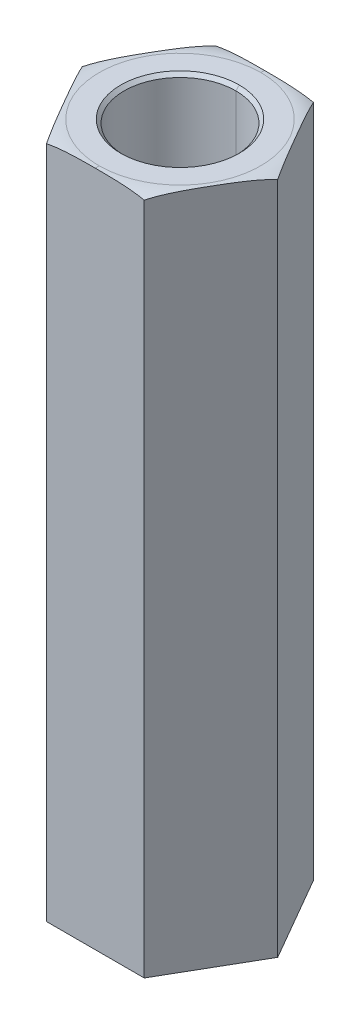
ISO-10303-21;
HEADER;
FILE_DESCRIPTION(('STEP AP214'),'2;1');
FILE_NAME('part.step','',(''),(''),'','','');
FILE_SCHEMA(('AUTOMOTIVE_DESIGN { 1 0 10303 214 1 1 1 1 }'));
ENDSEC;
DATA;
#1=APPLICATION_CONTEXT('core data for automotive mechanical design processes');
#2=APPLICATION_PROTOCOL_DEFINITION('international standard','automotive_design',2000,#1);
#3=PRODUCT_CONTEXT('',#1,'mechanical');
#4=PRODUCT('Part','Part','',(#3));
#5=PRODUCT_RELATED_PRODUCT_CATEGORY('part','',(#4));
#6=PRODUCT_DEFINITION_FORMATION('','',#4);
#7=PRODUCT_DEFINITION_CONTEXT('part definition',#1,'design');
#8=PRODUCT_DEFINITION('design','',#6,#7);
#9=PRODUCT_DEFINITION_SHAPE('','',#8);
#10=(LENGTH_UNIT() NAMED_UNIT(*) SI_UNIT(.MILLI.,.METRE.));
#11=(NAMED_UNIT(*) PLANE_ANGLE_UNIT() SI_UNIT($,.RADIAN.));
#12=(NAMED_UNIT(*) SI_UNIT($,.STERADIAN.) SOLID_ANGLE_UNIT());
#13=UNCERTAINTY_MEASURE_WITH_UNIT(LENGTH_MEASURE(1.E-05),#10,'distance_accuracy_value','');
#14=(GEOMETRIC_REPRESENTATION_CONTEXT(3) GLOBAL_UNCERTAINTY_ASSIGNED_CONTEXT((#13)) GLOBAL_UNIT_ASSIGNED_CONTEXT((#10,
#11,#12)) REPRESENTATION_CONTEXT('',''));
#15=CARTESIAN_POINT('',(0.,0.,0.));
#16=DIRECTION('',(0.,0.,1.));
#17=DIRECTION('',(1.,0.,0.));
#18=AXIS2_PLACEMENT_3D('',#15,#16,#17);
#19=CARTESIAN_POINT('',(-3.66617420935412,76.2,0.));
#20=DIRECTION('',(0.866025403784439,0.,0.5));
#21=DIRECTION('',(0.,-1.,0.));
#22=AXIS2_PLACEMENT_3D('',#19,#20,#21);
#23=PLANE('',#22);
#24=DIRECTION('',(-0.5,0.,0.866025403784439));
#25=VECTOR('',#24,1.);
#26=CARTESIAN_POINT('',(-3.66617420935412,50.8,0.));
#27=LINE('',#26,#25);
#28=CARTESIAN_POINT('',(-1.83308710467708,50.8,-3.175));
#29=VERTEX_POINT('',#28);
#30=CARTESIAN_POINT('',(-3.66617420935413,50.8,0.));
#31=VERTEX_POINT('',#30);
#32=EDGE_CURVE('E185',#29,#31,#27,.T.);
#33=ORIENTED_EDGE('',*,*,#32,.T.);
#34=DIRECTION('',(0.,-1.,0.));
#35=VECTOR('',#34,1.);
#36=CARTESIAN_POINT('',(-3.66617420935413,76.2,0.));
#37=LINE('',#36,#35);
#38=CARTESIAN_POINT('',(-3.66617420935412,76.073,0.));
#39=VERTEX_POINT('',#38);
#40=EDGE_CURVE('E197',#39,#31,#37,.T.);
#41=ORIENTED_EDGE('',*,*,#40,.F.);
#42=CARTESIAN_POINT('',(-1.83308710467706,76.073,-3.175));
#43=CARTESIAN_POINT('',(-1.87024866874892,76.0885009158898,-3.11057160864596));
#44=CARTESIAN_POINT('',(-1.90756346223036,76.1018156431562,-3.04575379589234));
#45=CARTESIAN_POINT('',(-1.98258101883529,76.1248069890922,-2.91547376910441));
#46=CARTESIAN_POINT('',(-2.02028451199559,76.1344745512069,-2.85001035979228));
#47=CARTESIAN_POINT('',(-2.09630105978957,76.1509062465137,-2.71833394195186));
#48=CARTESIAN_POINT('',(-2.13461656999061,76.1576448518415,-2.65211930950646));
#49=CARTESIAN_POINT('',(-2.21195240767693,76.1689164456647,-2.5185388478012));
#50=CARTESIAN_POINT('',(-2.25097444995731,76.1734136053112,-2.45117109158841));
#51=CARTESIAN_POINT('',(-2.32855052590926,76.1806754800541,-2.31685874328981));
#52=CARTESIAN_POINT('',(-2.36710568333616,76.1834548824334,-2.24991554859907));
#53=CARTESIAN_POINT('',(-2.4438529218735,76.1877921203691,-2.11674452604261));
#54=CARTESIAN_POINT('',(-2.48204443723343,76.1893627996394,-2.05051676476466));
#55=CARTESIAN_POINT('',(-2.55837968024612,76.1917078287948,-1.91831025043496));
#56=CARTESIAN_POINT('',(-2.59652315428835,76.1924847717044,-1.85233139266062));
#57=CARTESIAN_POINT('',(-2.67300367247286,76.1934940728267,-1.72008037116131));
#58=CARTESIAN_POINT('',(-2.71134080607808,76.1937239313039,-1.65380824205224));
#59=CARTESIAN_POINT('',(-2.78779362824686,76.1937229185725,-1.52141148352469));
#60=CARTESIAN_POINT('',(-2.82590963462342,76.1934934801607,-1.45528703761391));
#61=CARTESIAN_POINT('',(-2.9020629053945,76.1924875053469,-1.3232151463295));
#62=CARTESIAN_POINT('',(-2.94010013043662,76.1917123281715,-1.25726766896534));
#63=CARTESIAN_POINT('',(-3.01637496107305,76.1893748391711,-1.12514580542029));
#64=CARTESIAN_POINT('',(-3.05461275530814,76.187809359476,-1.05897157909141));
#65=CARTESIAN_POINT('',(-3.1314938213222,76.1834896133415,-0.925982444133844));
#66=CARTESIAN_POINT('',(-3.17013720645552,76.1807232490973,-0.859167969028904));
#67=CARTESIAN_POINT('',(-3.24715858676475,76.173525109243,-0.72574969079345));
#68=CARTESIAN_POINT('',(-3.28553703394474,76.1690985676939,-0.659145882122327));
#69=CARTESIAN_POINT('',(-3.36209822004462,76.1579698521673,-0.526315533370278));
#70=CARTESIAN_POINT('',(-3.40028117866843,76.1512755376251,-0.460088482912216));
#71=CARTESIAN_POINT('',(-3.47655888890391,76.1349004136586,-0.32797175062727));
#72=CARTESIAN_POINT('',(-3.51465366955102,76.1252207927488,-0.262081945129717));
#73=CARTESIAN_POINT('',(-3.59063825645809,76.1021129162483,-0.130678095569553));
#74=CARTESIAN_POINT('',(-3.62852752777413,76.0886774888161,-0.0651650175844497));
#75=CARTESIAN_POINT('',(-3.66617420935412,76.073,0.));
#76=B_SPLINE_CURVE_WITH_KNOTS('',3,(#42,#43,#44,#45,#46,#47,#48,#49,#50,#51,#52,#53,#54,#55,#56,
#57,#58,#59,#60,#61,#62,#63,#64,#65,#66,#67,#68,#69,#70,#71,#72,#73,#74,#75),.UNSPECIFIED.,.F.,
.F.,(4,2,2,2,2,2,2,2,2,2,2,2,2,2,2,2,4),(0.,0.22783544676785,0.456232982429659,0.68658308063275,
0.920505784101285,1.15239966581257,1.3817940881286,1.61043669147783,1.84012201855094,
2.06909194866786,2.29749361053769,2.52681816088968,2.75850859757797,2.98947463881837,
3.21964827240865,3.44973038697835,3.68025488817963),.UNSPECIFIED.);
#77=CARTESIAN_POINT('',(-1.83308710467706,76.073,-3.175));
#78=VERTEX_POINT('',#77);
#79=EDGE_CURVE('E345',#39,#78,#76,.F.);
#80=ORIENTED_EDGE('',*,*,#79,.T.);
#81=DIRECTION('',(0.,1.,0.));
#82=VECTOR('',#81,1.);
#83=CARTESIAN_POINT('',(-1.83308710467708,76.2,-3.175));
#84=LINE('',#83,#82);
#85=EDGE_CURVE('E51',#29,#78,#84,.T.);
#86=ORIENTED_EDGE('',*,*,#85,.F.);
#87=EDGE_LOOP('',(#33,#41,#80,#86));
#88=FACE_BOUND('',#87,.T.);
#89=ADVANCED_FACE('F47',(#88),#23,.F.);
#90=CARTESIAN_POINT('',(-1.83308710467706,76.2,3.175));
#91=DIRECTION('',(0.866025403784439,0.,-0.5));
#92=DIRECTION('',(0.,-1.,0.));
#93=AXIS2_PLACEMENT_3D('',#90,#91,#92);
#94=PLANE('',#93);
#95=DIRECTION('',(0.5,0.,0.866025403784439));
#96=VECTOR('',#95,1.);
#97=CARTESIAN_POINT('',(-1.83308710467706,50.8,3.175));
#98=LINE('',#97,#96);
#99=CARTESIAN_POINT('',(-1.83308710467704,50.8,3.175));
#100=VERTEX_POINT('',#99);
#101=EDGE_CURVE('E179',#31,#100,#98,.T.);
#102=ORIENTED_EDGE('',*,*,#101,.T.);
#103=DIRECTION('',(0.,-1.,0.));
#104=VECTOR('',#103,1.);
#105=CARTESIAN_POINT('',(-1.83308710467704,76.2,3.175));
#106=LINE('',#105,#104);
#107=CARTESIAN_POINT('',(-1.83308710467705,76.073,3.175));
#108=VERTEX_POINT('',#107);
#109=EDGE_CURVE('E170',#108,#100,#106,.T.);
#110=ORIENTED_EDGE('',*,*,#109,.F.);
#111=CARTESIAN_POINT('',(-3.66617420935412,76.073,0.));
#112=CARTESIAN_POINT('',(-3.62857603990986,76.0886573463129,0.0650810584661239));
#113=CARTESIAN_POINT('',(-3.59073546774609,76.1020784850675,0.130509138226514));
#114=CARTESIAN_POINT('',(-3.51484989147459,76.1251660484383,0.261739474457937));
#115=CARTESIAN_POINT('',(-3.47680543261392,76.1348397722548,0.327540747638441));
#116=CARTESIAN_POINT('',(-3.40063015131929,76.1512086054002,0.459477270534229));
#117=CARTESIAN_POINT('',(-3.36249930308035,76.1579026590942,0.525612630230573));
#118=CARTESIAN_POINT('',(-3.28604644475101,76.1690337907513,0.658257229550373));
#119=CARTESIAN_POINT('',(-3.24772422503457,76.173463133503,0.72476697636106));
#120=CARTESIAN_POINT('',(-3.17070172266464,76.1806794880851,0.858193236417918));
#121=CARTESIAN_POINT('',(-3.13200055892338,76.1834563335153,0.925109760073331));
#122=CARTESIAN_POINT('',(-3.05500742159172,76.1877916250156,1.0582918136033));
#123=CARTESIAN_POINT('',(-3.0167153571113,76.1893623795008,1.12455691587817));
#124=CARTESIAN_POINT('',(-2.94033699623329,76.1917072311022,1.25685272825033));
#125=CARTESIAN_POINT('',(-2.90225050434311,76.1924845999971,1.32288327275756));
#126=CARTESIAN_POINT('',(-2.82600443358918,76.1934931535726,1.4551167807033));
#127=CARTESIAN_POINT('',(-2.78784489823357,76.1937230252486,1.52131977821863));
#128=CARTESIAN_POINT('',(-2.71139474300874,76.1937238233541,1.65371775341467));
#129=CARTESIAN_POINT('',(-2.67310404505366,76.1934943976824,1.71991268600846));
#130=CARTESIAN_POINT('',(-2.59671751598941,76.1924876749217,1.85200205182963));
#131=CARTESIAN_POINT('',(-2.55862160425315,76.191712922053,1.91789645584361));
#132=CARTESIAN_POINT('',(-2.48238558092739,76.1893752519673,2.0499261010972));
#133=CARTESIAN_POINT('',(-2.44424571284584,76.1878098408839,2.11606144290717));
#134=CARTESIAN_POINT('',(-2.36760910470934,76.1834881555598,2.24903944072012));
#135=CARTESIAN_POINT('',(-2.32911294406295,76.1807192398753,2.31588204486321));
#136=CARTESIAN_POINT('',(-2.25154109297378,76.1734756216343,2.4501921496318));
#137=CARTESIAN_POINT('',(-2.21246390057516,76.1689812955924,2.51765778576073));
#138=CARTESIAN_POINT('',(-2.13501946426464,76.1577120314406,2.65142695536615));
#139=CARTESIAN_POINT('',(-2.09665052530399,76.1509731359405,2.71773243961721));
#140=CARTESIAN_POINT('',(-2.02053002242249,76.1345349955737,2.84958649814701));
#141=CARTESIAN_POINT('',(-1.98277598390404,76.1248614806103,2.91513670590539));
#142=CARTESIAN_POINT('',(-1.90765954903898,76.1018498042125,3.04558720037253));
#143=CARTESIAN_POINT('',(-1.87029641091841,76.0885208398345,3.11048870002124));
#144=CARTESIAN_POINT('',(-1.83308710467705,76.073,3.175));
#145=B_SPLINE_CURVE_WITH_KNOTS('',3,(#111,#112,#113,#114,#115,#116,#117,#118,#119,#120,#121,
#122,#123,#124,#125,#126,#127,#128,#129,#130,#131,#132,#133,#134,#135,#136,#137,#138,#139,#140,
#141,#142,#143,#144),.UNSPECIFIED.,.F.,.F.,(4,2,2,2,2,2,2,2,2,2,2,2,2,2,2,2,4),(0.,
0.230227835450546,0.460004951740673,0.689863408586195,0.920501797898279,1.15254481972427,
1.38218710684066,1.61087851684059,1.84011782339944,2.06953293394091,2.29788474404535,
2.52696135383973,2.75850460877142,2.99276324357109,3.22342830872475,3.45212671631271,
3.68025491892986),.UNSPECIFIED.);
#146=EDGE_CURVE('E400',#108,#39,#145,.F.);
#147=ORIENTED_EDGE('',*,*,#146,.T.);
#148=ORIENTED_EDGE('',*,*,#40,.T.);
#149=EDGE_LOOP('',(#102,#110,#147,#148));
#150=FACE_BOUND('',#149,.T.);
#151=ADVANCED_FACE('F262',(#150),#94,.F.);
#152=CARTESIAN_POINT('',(-1.83308710467707,76.2,-3.175));
#153=DIRECTION('',(0.,0.,1.));
#154=DIRECTION('',(-1.,0.,0.));
#155=AXIS2_PLACEMENT_3D('',#152,#153,#154);
#156=PLANE('',#155);
#157=DIRECTION('',(-1.,0.,0.));
#158=VECTOR('',#157,1.);
#159=CARTESIAN_POINT('',(-1.83308710467707,50.8,-3.175));
#160=LINE('',#159,#158);
#161=CARTESIAN_POINT('',(1.83308710467706,50.8,-3.175));
#162=VERTEX_POINT('',#161);
#163=EDGE_CURVE('E176',#162,#29,#160,.T.);
#164=ORIENTED_EDGE('',*,*,#163,.T.);
#165=ORIENTED_EDGE('',*,*,#85,.T.);
#166=CARTESIAN_POINT('',(0.,76.1937234241492,-3.17499999999999));
#167=CARTESIAN_POINT('',(-0.075636863634639,76.1936960254449,-3.17501066489789));
#168=CARTESIAN_POINT('',(-0.151275010800483,76.1934824757255,-3.17504525775912));
#169=CARTESIAN_POINT('',(-0.303213562743493,76.1924892247866,-3.17510998257145));
#170=CARTESIAN_POINT('',(-0.379513933004122,76.1917045538003,-3.17514007255007));
#171=CARTESIAN_POINT('',(-0.53279078442746,76.1893584184998,-3.17514142722247));
#172=CARTESIAN_POINT('',(-0.609767169640868,76.1877900259288,-3.17511215999884));
#173=CARTESIAN_POINT('',(-0.764315740476909,76.1834613786496,-3.17504603210459));
#174=CARTESIAN_POINT('',(-0.841887676523301,76.1806915279377,-3.17500911157375));
#175=CARTESIAN_POINT('',(-0.994697309140619,76.1735328087819,-3.17499115375589));
#176=CARTESIAN_POINT('',(-1.06993719959864,76.1691934350196,-3.17500852045277));
#177=CARTESIAN_POINT('',(-1.22128262971438,76.1582500389527,-3.17502770869944));
#178=CARTESIAN_POINT('',(-1.2973860697604,76.1516161000904,-3.17502931622034));
#179=CARTESIAN_POINT('',(-1.45015100779301,76.135334017818,-3.17502523248822));
#180=CARTESIAN_POINT('',(-1.5268091516445,76.1256528031094,-3.17501945891771));
#181=CARTESIAN_POINT('',(-1.68015447671397,76.1024365864212,-3.17500785688713));
#182=CARTESIAN_POINT('',(-1.75683707198954,76.0888716465296,-3.1750020283547));
#183=CARTESIAN_POINT('',(-1.83308710467706,76.073,-3.17499999999999));
#184=B_SPLINE_CURVE_WITH_KNOTS('',3,(#166,#167,#168,#169,#170,#171,#172,#173,#174,#175,#176,
#177,#178,#179,#180,#181,#182,#183),.UNSPECIFIED.,.F.,.F.,(4,2,2,2,2,2,2,2,4),(0.,
0.226912411939527,0.455823335930587,0.686794660909837,0.919645729486527,1.1457161588969,
1.37485271615622,1.60656714808351,1.84011821010097),.UNSPECIFIED.);
#185=CARTESIAN_POINT('',(0.,76.1937234241492,-3.175));
#186=VERTEX_POINT('',#185);
#187=EDGE_CURVE('E337',#78,#186,#184,.F.);
#188=ORIENTED_EDGE('',*,*,#187,.T.);
#189=CARTESIAN_POINT('',(1.83308710467707,76.073,-3.17499999999999));
#190=CARTESIAN_POINT('',(1.75683109925452,76.0888729569933,-3.17500194024686));
#191=CARTESIAN_POINT('',(1.68014248244779,76.10243900426,-3.17500700591373));
#192=CARTESIAN_POINT('',(1.5267895199563,76.1256562432473,-3.17501674755619));
#193=CARTESIAN_POINT('',(1.45012979423013,76.1353375952218,-3.17502142630084));
#194=CARTESIAN_POINT('',(1.29736551787488,76.151619232463,-3.17502397789243));
#195=CARTESIAN_POINT('',(1.22126433668409,76.1582527401453,-3.17502192621219));
#196=CARTESIAN_POINT('',(1.06992650061115,76.169194810616,-3.17500443194673));
#197=CARTESIAN_POINT('',(0.99469195175094,76.173533383897,-3.17498916946454));
#198=CARTESIAN_POINT('',(0.841880548843443,76.180691527938,-3.1750111572008));
#199=CARTESIAN_POINT('',(0.764301489404732,76.18346133646,-3.17505000516481));
#200=CARTESIAN_POINT('',(0.609743963264254,76.1877899213243,-3.17511742428739));
#201=CARTESIAN_POINT('',(0.53276574817571,76.1893583720841,-3.17514607652628));
#202=CARTESIAN_POINT('',(0.379489721819273,76.191704531393,-3.1751431438341));
#203=CARTESIAN_POINT('',(0.303192007128639,76.1924892132941,-3.17511209744143));
#204=CARTESIAN_POINT('',(0.151262410881451,76.1934824631384,-3.17504585249403));
#205=CARTESIAN_POINT('',(0.0756305640321453,76.1936960280823,-3.17501069278199));
#206=CARTESIAN_POINT('',(0.,76.1937234241492,-3.175));
#207=B_SPLINE_CURVE_WITH_KNOTS('',3,(#189,#190,#191,#192,#193,#194,#195,#196,#197,#198,#199,
#200,#201,#202,#203,#204,#205,#206),.UNSPECIFIED.,.F.,.F.,(4,2,2,2,2,2,2,2,4),(0.,
0.233569407784052,0.46528859567224,0.694418280509748,0.920472575073992,1.15334500289202,
1.38432182079272,1.61322477959545,1.84011829197034),.UNSPECIFIED.);
#208=CARTESIAN_POINT('',(1.83308710467706,76.073,-3.175));
#209=VERTEX_POINT('',#208);
#210=EDGE_CURVE('E231',#186,#209,#207,.F.);
#211=ORIENTED_EDGE('',*,*,#210,.T.);
#212=DIRECTION('',(0.,1.,0.));
#213=VECTOR('',#212,1.);
#214=CARTESIAN_POINT('',(1.83308710467706,76.2,-3.175));
#215=LINE('',#214,#213);
#216=EDGE_CURVE('E627',#162,#209,#215,.T.);
#217=ORIENTED_EDGE('',*,*,#216,.F.);
#218=EDGE_LOOP('',(#164,#165,#188,#211,#217));
#219=FACE_BOUND('',#218,.T.);
#220=ADVANCED_FACE('F265',(#219),#156,.F.);
#221=CARTESIAN_POINT('',(1.83308710467706,76.2,-3.175));
#222=DIRECTION('',(-0.866025403784439,0.,0.5));
#223=DIRECTION('',(-0.5,0.,-0.866025403784439));
#224=AXIS2_PLACEMENT_3D('',#221,#222,#223);
#225=PLANE('',#224);
#226=DIRECTION('',(-0.5,0.,-0.866025403784439));
#227=VECTOR('',#226,1.);
#228=CARTESIAN_POINT('',(1.83308710467706,50.8,-3.175));
#229=LINE('',#228,#227);
#230=CARTESIAN_POINT('',(3.66617420935412,50.8,0.));
#231=VERTEX_POINT('',#230);
#232=EDGE_CURVE('E167',#231,#162,#229,.T.);
#233=ORIENTED_EDGE('',*,*,#232,.T.);
#234=ORIENTED_EDGE('',*,*,#216,.T.);
#235=CARTESIAN_POINT('',(3.66617420935412,76.073,0.));
#236=CARTESIAN_POINT('',(3.62857603991845,76.0886573463093,-0.0650810584515651));
#237=CARTESIAN_POINT('',(3.59073546776478,76.1020784850608,-0.130509138198106));
#238=CARTESIAN_POINT('',(3.51484989150829,76.1251660484288,-0.261739474412522));
#239=CARTESIAN_POINT('',(3.47680543265247,76.1348397722449,-0.327540747589949));
#240=CARTESIAN_POINT('',(3.40063015136067,76.1512086053916,-0.459477270488453));
#241=CARTESIAN_POINT('',(3.36249930311969,76.1579026590869,-0.525612630190635));
#242=CARTESIAN_POINT('',(3.2860464447759,76.1690337907476,-0.658257229527629));
#243=CARTESIAN_POINT('',(3.24772422504703,76.1734631335015,-0.724766976349681));
#244=CARTESIAN_POINT('',(3.17070172266832,76.1806794880852,-0.858193236401264));
#245=CARTESIAN_POINT('',(3.13200055893077,76.1834563335156,-0.925109760040036));
#246=CARTESIAN_POINT('',(3.05500742160634,76.1877916250161,-1.0582918135494));
#247=CARTESIAN_POINT('',(3.0167153571294,76.1893623795011,-1.12455691582027));
#248=CARTESIAN_POINT('',(2.94033699625418,76.1917072311024,-1.25685272819446));
#249=CARTESIAN_POINT('',(2.90225050436333,76.1924845999973,-1.32288327270773));
#250=CARTESIAN_POINT('',(2.82600443360262,76.1934931535727,-1.45511678067434));
#251=CARTESIAN_POINT('',(2.78784489824092,76.1937230252487,-1.52131977820451));
#252=CARTESIAN_POINT('',(2.71139474300239,76.193723823354,-1.65371775342703));
#253=CARTESIAN_POINT('',(2.67310404503971,76.1934943976823,-1.71991268603246));
#254=CARTESIAN_POINT('',(2.59671751596425,76.1924876749216,-1.8520020518681));
#255=CARTESIAN_POINT('',(2.55862160422439,76.1917129220529,-1.91789645588492));
#256=CARTESIAN_POINT('',(2.48238558089661,76.1893752519672,-2.04992610113668));
#257=CARTESIAN_POINT('',(2.44424571281664,76.1878098408838,-2.11606144294198));
#258=CARTESIAN_POINT('',(2.36760910469089,76.1834881555596,-2.24903944074018));
#259=CARTESIAN_POINT('',(2.3291129440537,76.1807192398752,-2.31588204487321));
#260=CARTESIAN_POINT('',(2.2515410929705,76.1734756216333,-2.45019214964356));
#261=CARTESIAN_POINT('',(2.21246390056861,76.1689812955898,-2.51765778578425));
#262=CARTESIAN_POINT('',(2.13501946425214,76.1577120314356,-2.65142695540448));
#263=CARTESIAN_POINT('',(2.09665052528885,76.1509731359346,-2.71773243965862));
#264=CARTESIAN_POINT('',(2.02053002240534,76.134534995567,-2.84958649818728));
#265=CARTESIAN_POINT('',(1.98277598388753,76.1248614806038,-2.91513670594145));
#266=CARTESIAN_POINT('',(1.90765954902816,76.1018498042079,-3.04558720039353));
#267=CARTESIAN_POINT('',(1.87029641091261,76.0885208398321,-3.11048870003145));
#268=CARTESIAN_POINT('',(1.83308710467706,76.0730000000001,-3.17499999999999));
#269=B_SPLINE_CURVE_WITH_KNOTS('',3,(#235,#236,#237,#238,#239,#240,#241,#242,#243,#244,#245,
#246,#247,#248,#249,#250,#251,#252,#253,#254,#255,#256,#257,#258,#259,#260,#261,#262,#263,#264,
#265,#266,#267,#268),.UNSPECIFIED.,.F.,.F.,(4,2,2,2,2,2,2,2,2,2,2,2,2,2,2,2,4),(0.,
0.230227835398656,0.460004951673491,0.689863408537525,0.920501797898038,1.1525448196753,
1.38218710677607,1.61087851679271,1.84011782339924,2.06953293398236,2.29788474409958,
2.52696135387944,2.75850460877125,2.99276324360654,3.22342830877238,3.45212671634846,
3.68025491892952),.UNSPECIFIED.);
#270=CARTESIAN_POINT('',(3.66617420935412,76.073,0.));
#271=VERTEX_POINT('',#270);
#272=EDGE_CURVE('E76',#209,#271,#269,.F.);
#273=ORIENTED_EDGE('',*,*,#272,.T.);
#274=DIRECTION('',(0.,1.,0.));
#275=VECTOR('',#274,1.);
#276=CARTESIAN_POINT('',(3.66617420935412,76.2,0.));
#277=LINE('',#276,#275);
#278=EDGE_CURVE('E161',#231,#271,#277,.T.);
#279=ORIENTED_EDGE('',*,*,#278,.F.);
#280=EDGE_LOOP('',(#233,#234,#273,#279));
#281=FACE_BOUND('',#280,.T.);
#282=ADVANCED_FACE('F166',(#281),#225,.F.);
#283=CARTESIAN_POINT('',(1.83308710467705,76.2,3.175));
#284=DIRECTION('',(0.,0.,-1.));
#285=DIRECTION('',(1.,0.,0.));
#286=AXIS2_PLACEMENT_3D('',#283,#284,#285);
#287=PLANE('',#286);
#288=DIRECTION('',(1.,0.,0.));
#289=VECTOR('',#288,1.);
#290=CARTESIAN_POINT('',(1.83308710467705,50.8,3.175));
#291=LINE('',#290,#289);
#292=CARTESIAN_POINT('',(1.83308710467706,50.8,3.175));
#293=VERTEX_POINT('',#292);
#294=EDGE_CURVE('E177',#100,#293,#291,.T.);
#295=ORIENTED_EDGE('',*,*,#294,.T.);
#296=DIRECTION('',(0.,-1.,0.));
#297=VECTOR('',#296,1.);
#298=CARTESIAN_POINT('',(1.83308710467705,76.2,3.175));
#299=LINE('',#298,#297);
#300=CARTESIAN_POINT('',(1.83308710467705,76.073,3.175));
#301=VERTEX_POINT('',#300);
#302=EDGE_CURVE('E163',#301,#293,#299,.T.);
#303=ORIENTED_EDGE('',*,*,#302,.F.);
#304=CARTESIAN_POINT('',(0.,76.1937234241492,3.175));
#305=CARTESIAN_POINT('',(0.0756368636323945,76.1936960254449,3.17501066489791));
#306=CARTESIAN_POINT('',(0.151275010795994,76.1934824757255,3.17504525775934));
#307=CARTESIAN_POINT('',(0.303213562735812,76.1924892247866,3.17510998257221));
#308=CARTESIAN_POINT('',(0.379513932995495,76.1917045538003,3.17514007255117));
#309=CARTESIAN_POINT('',(0.532790784418539,76.1893584184998,3.17514142722414));
#310=CARTESIAN_POINT('',(0.6097671696326,76.1877900259287,3.17511216000072));
#311=CARTESIAN_POINT('',(0.764315740471832,76.1834613786496,3.17504603210602));
#312=CARTESIAN_POINT('',(0.841887676520762,76.1806915279377,3.17500911157448));
#313=CARTESIAN_POINT('',(0.994697309138708,76.1735328087821,3.17499115375519));
#314=CARTESIAN_POINT('',(1.06993719959483,76.1691934350201,3.17500852045132));
#315=CARTESIAN_POINT('',(1.22128262970785,76.1582500389537,3.17502770869739));
#316=CARTESIAN_POINT('',(1.29738606975306,76.1516161000915,3.17502931621845));
#317=CARTESIAN_POINT('',(1.45015100778544,76.1353340178193,3.17502523248687));
#318=CARTESIAN_POINT('',(1.52680915163749,76.1256528031107,3.17501945891676));
#319=CARTESIAN_POINT('',(1.68015447670969,76.102436586422,3.17500785688683));
#320=CARTESIAN_POINT('',(1.7568370719874,76.0888716465301,3.17500202835468));
#321=CARTESIAN_POINT('',(1.83308710467705,76.073,3.175));
#322=B_SPLINE_CURVE_WITH_KNOTS('',3,(#304,#305,#306,#307,#308,#309,#310,#311,#312,#313,#314,
#315,#316,#317,#318,#319,#320,#321),.UNSPECIFIED.,.F.,.F.,(4,2,2,2,2,2,2,2,4),(0.,
0.226912411932793,0.455823335921015,0.686794660902223,0.919645729486525,1.14571615889113,
1.37485271614801,1.606567148077,1.84011821010099),.UNSPECIFIED.);
#323=CARTESIAN_POINT('',(0.,76.1937234241492,3.175));
#324=VERTEX_POINT('',#323);
#325=EDGE_CURVE('E232',#301,#324,#322,.F.);
#326=ORIENTED_EDGE('',*,*,#325,.T.);
#327=CARTESIAN_POINT('',(-1.83308710467706,76.073,3.175));
#328=CARTESIAN_POINT('',(-1.75683109925776,76.0888729569926,3.17500194024692));
#329=CARTESIAN_POINT('',(-1.68014248245432,76.1024390042586,3.17500700591421));
#330=CARTESIAN_POINT('',(-1.52678951996699,76.1256562432454,3.17501674755767));
#331=CARTESIAN_POINT('',(-1.45012979424169,76.1353375952198,3.17502142630292));
#332=CARTESIAN_POINT('',(-1.29736551788607,76.1516192324613,3.17502397789535));
#333=CARTESIAN_POINT('',(-1.22126433669406,76.1582527401438,3.17502192621534));
#334=CARTESIAN_POINT('',(-1.06992650061697,76.1691948106153,3.17500443194896));
#335=CARTESIAN_POINT('',(-0.994691951753855,76.1735333838967,3.17498916946562));
#336=CARTESIAN_POINT('',(-0.841880548847317,76.180691527938,3.1750111571997));
#337=CARTESIAN_POINT('',(-0.764301489412483,76.18346133646,3.17505000516266));
#338=CARTESIAN_POINT('',(-0.609743963276879,76.1877899213243,3.17511742428454));
#339=CARTESIAN_POINT('',(-0.532765748189331,76.1893583720841,3.17514607652376));
#340=CARTESIAN_POINT('',(-0.379489721832446,76.191704531393,3.17514314383243));
#341=CARTESIAN_POINT('',(-0.303192007140366,76.1924892132941,3.17511209744029));
#342=CARTESIAN_POINT('',(-0.151262410888306,76.1934824631384,3.17504585249371));
#343=CARTESIAN_POINT('',(-0.0756305640355726,76.1936960280823,3.17501069278198));
#344=CARTESIAN_POINT('',(0.,76.1937234241492,3.175));
#345=B_SPLINE_CURVE_WITH_KNOTS('',3,(#327,#328,#329,#330,#331,#332,#333,#334,#335,#336,#337,
#338,#339,#340,#341,#342,#343,#344),.UNSPECIFIED.,.F.,.F.,(4,2,2,2,2,2,2,2,4),(0.,
0.233569407774044,0.465288595659643,0.694418280500895,0.920472575073931,1.15334500288033,
1.38432182077804,1.61322477958511,1.84011829197028),.UNSPECIFIED.);
#346=EDGE_CURVE('E410',#324,#108,#345,.F.);
#347=ORIENTED_EDGE('',*,*,#346,.T.);
#348=ORIENTED_EDGE('',*,*,#109,.T.);
#349=EDGE_LOOP('',(#295,#303,#326,#347,#348));
#350=FACE_BOUND('',#349,.T.);
#351=ADVANCED_FACE('F302',(#350),#287,.F.);
#352=CARTESIAN_POINT('',(3.66617420935412,76.2,0.));
#353=DIRECTION('',(-0.866025403784439,0.,-0.5));
#354=DIRECTION('',(0.,1.,0.));
#355=AXIS2_PLACEMENT_3D('',#352,#353,#354);
#356=PLANE('',#355);
#357=DIRECTION('',(0.5,0.,-0.866025403784439));
#358=VECTOR('',#357,1.);
#359=CARTESIAN_POINT('',(3.66617420935412,50.8,0.));
#360=LINE('',#359,#358);
#361=EDGE_CURVE('E11',#293,#231,#360,.T.);
#362=ORIENTED_EDGE('',*,*,#361,.T.);
#363=ORIENTED_EDGE('',*,*,#278,.T.);
#364=CARTESIAN_POINT('',(1.83308710467705,76.073,3.17500000000001));
#365=CARTESIAN_POINT('',(1.87024866874333,76.0885009158874,3.11057160865575));
#366=CARTESIAN_POINT('',(1.90756346221997,76.1018156431518,3.04575379591246));
#367=CARTESIAN_POINT('',(1.98258101881946,76.124806989086,2.91547376913896));
#368=CARTESIAN_POINT('',(2.02028451197916,76.1344745512005,2.85001035983086));
#369=CARTESIAN_POINT('',(2.09630105977503,76.1509062465081,2.71833394199153));
#370=CARTESIAN_POINT('',(2.13461656997857,76.1576448518367,2.65211930954316));
#371=CARTESIAN_POINT('',(2.21195240767069,76.1689164456623,2.51853884782376));
#372=CARTESIAN_POINT('',(2.25097444995432,76.1734136053102,2.45117109159978));
#373=CARTESIAN_POINT('',(2.32855052590397,76.1806754800544,2.31685874329281));
#374=CARTESIAN_POINT('',(2.36710568332537,76.1834548824339,2.24991554860493));
#375=CARTESIAN_POINT('',(2.44385292185608,76.1877921203699,2.11674452605307));
#376=CARTESIAN_POINT('',(2.48204443721485,76.1893627996401,2.05051676477686));
#377=CARTESIAN_POINT('',(2.55837968022827,76.1917078287954,1.91831025044815));
#378=CARTESIAN_POINT('',(2.59652315427239,76.1924847717049,1.85233139267306));
#379=CARTESIAN_POINT('',(2.67300367246349,76.193494072827,1.72008037116912));
#380=CARTESIAN_POINT('',(2.71134080607341,76.1937239313041,1.65380824205615));
#381=CARTESIAN_POINT('',(2.78779362824622,76.1937229185723,1.52141148352991));
#382=CARTESIAN_POINT('',(2.82590963462211,76.1934934801603,1.45528703762434));
#383=CARTESIAN_POINT('',(2.90206290539275,76.1924875053463,1.32321514634707));
#384=CARTESIAN_POINT('',(2.94010013043511,76.1917123281709,1.25726766898486));
#385=CARTESIAN_POINT('',(3.01637496107251,76.1893748391704,1.12514580544028));
#386=CARTESIAN_POINT('',(3.05461275530834,76.1878093594752,1.05897157910993));
#387=CARTESIAN_POINT('',(3.13149382132277,76.1834896133409,0.925982444145175));
#388=CARTESIAN_POINT('',(3.17013720645572,76.180723249097,0.859167969034512));
#389=CARTESIAN_POINT('',(3.2471585867577,76.1735251092439,0.725749690799702));
#390=CARTESIAN_POINT('',(3.28553703393086,76.169098567696,0.659145882134946));
#391=CARTESIAN_POINT('',(3.36209822002277,76.1579698521714,0.526315533392494));
#392=CARTESIAN_POINT('',(3.40028117864541,76.1512755376299,0.460088482937668));
#393=CARTESIAN_POINT('',(3.47655888888245,76.1349004136641,0.327971750654227));
#394=CARTESIAN_POINT('',(3.51465366953226,76.1252207927541,0.262081945154969));
#395=CARTESIAN_POINT('',(3.59063825644769,76.102112916252,0.130678095585357));
#396=CARTESIAN_POINT('',(3.62852752776935,76.0886774888182,0.0651650175925537));
#397=CARTESIAN_POINT('',(3.66617420935412,76.073,0.));
#398=B_SPLINE_CURVE_WITH_KNOTS('',3,(#364,#365,#366,#367,#368,#369,#370,#371,#372,#373,#374,
#375,#376,#377,#378,#379,#380,#381,#382,#383,#384,#385,#386,#387,#388,#389,#390,#391,#392,#393,
#394,#395,#396,#397),.UNSPECIFIED.,.F.,.F.,(4,2,2,2,2,2,2,2,2,2,2,2,2,2,2,2,4),(0.,
0.227835446733302,0.456232982383738,0.686583080598492,0.920505784101155,1.15239966579678,
1.38179408810659,1.61043669146057,1.84012201855085,2.06909194865325,2.29749361051838,
2.52681816087531,2.75850859757785,2.98947463879131,3.2196482723713,3.4497303869495,
3.68025488817964),.UNSPECIFIED.);
#399=EDGE_CURVE('E171',#271,#301,#398,.F.);
#400=ORIENTED_EDGE('',*,*,#399,.T.);
#401=ORIENTED_EDGE('',*,*,#302,.T.);
#402=EDGE_LOOP('',(#362,#363,#400,#401));
#403=FACE_BOUND('',#402,.T.);
#404=ADVANCED_FACE('F159',(#403),#356,.F.);
#405=CARTESIAN_POINT('',(0.,63.5,0.));
#406=DIRECTION('',(0.,1.,0.));
#407=DIRECTION('',(1.,0.,0.));
#408=AXIS2_PLACEMENT_3D('',#405,#406,#407);
#409=PLANE('',#408);
#410=CARTESIAN_POINT('',(0.,63.5,0.));
#411=DIRECTION('',(0.,-1.,0.));
#412=DIRECTION('',(0.,0.,-1.));
#413=AXIS2_PLACEMENT_3D('',#410,#411,#412);
#414=CIRCLE('',#413,2.0955);
#415=CARTESIAN_POINT('',(0.,63.5,-2.0955));
#416=VERTEX_POINT('',#415);
#417=CARTESIAN_POINT('',(0.,63.5,2.0955));
#418=VERTEX_POINT('',#417);
#419=EDGE_CURVE('E57',#416,#418,#414,.T.);
#420=ORIENTED_EDGE('',*,*,#419,.F.);
#421=CARTESIAN_POINT('',(0.,63.5,0.));
#422=DIRECTION('',(0.,-1.,0.));
#423=DIRECTION('',(0.,0.,-1.));
#424=AXIS2_PLACEMENT_3D('',#421,#422,#423);
#425=CIRCLE('',#424,2.0955);
#426=EDGE_CURVE('E212',#418,#416,#425,.T.);
#427=ORIENTED_EDGE('',*,*,#426,.F.);
#428=EDGE_LOOP('',(#420,#427));
#429=FACE_BOUND('',#428,.T.);
#430=ADVANCED_FACE('F312',(#429),#409,.T.);
#431=CARTESIAN_POINT('',(0.,63.5,0.));
#432=DIRECTION('',(0.,1.,0.));
#433=DIRECTION('',(0.,0.,-1.));
#434=AXIS2_PLACEMENT_3D('',#431,#432,#433);
#435=CYLINDRICAL_SURFACE('',#434,2.0955);
#436=DIRECTION('',(0.,1.,0.));
#437=VECTOR('',#436,1.);
#438=CARTESIAN_POINT('',(0.,63.5,2.0955));
#439=LINE('',#438,#437);
#440=CARTESIAN_POINT('',(0.,76.0729999999512,2.09549999993897));
#441=VERTEX_POINT('',#440);
#442=EDGE_CURVE('E207',#418,#441,#439,.T.);
#443=ORIENTED_EDGE('',*,*,#442,.T.);
#444=CARTESIAN_POINT('',(0.,76.0729999999512,0.));
#445=DIRECTION('',(0.,-1.,0.));
#446=DIRECTION('',(0.,0.,-1.));
#447=AXIS2_PLACEMENT_3D('',#444,#445,#446);
#448=CIRCLE('',#447,2.09549999993897);
#449=CARTESIAN_POINT('',(0.,76.0729999999512,-2.09549999993897));
#450=VERTEX_POINT('',#449);
#451=EDGE_CURVE('E196',#450,#441,#448,.T.);
#452=ORIENTED_EDGE('',*,*,#451,.F.);
#453=DIRECTION('',(0.,1.,0.));
#454=VECTOR('',#453,1.);
#455=CARTESIAN_POINT('',(0.,63.5,-2.0955));
#456=LINE('',#455,#454);
#457=EDGE_CURVE('E211',#416,#450,#456,.T.);
#458=ORIENTED_EDGE('',*,*,#457,.F.);
#459=ORIENTED_EDGE('',*,*,#419,.T.);
#460=EDGE_LOOP('',(#443,#452,#458,#459));
#461=FACE_BOUND('',#460,.T.);
#462=ADVANCED_FACE('F49',(#461),#435,.F.);
#463=CARTESIAN_POINT('',(0.,76.1999999999716,0.));
#464=DIRECTION('',(0.,1.,0.));
#465=DIRECTION('',(0.,0.,-1.));
#466=AXIS2_PLACEMENT_3D('',#463,#464,#465);
#467=CONICAL_SURFACE('',#466,2.22249999995938,0.785398163397448);
#468=DIRECTION('',(0.,0.707106781186548,0.707106781186548));
#469=VECTOR('',#468,1.);
#470=CARTESIAN_POINT('',(0.,76.1999999999716,2.22249999995938));
#471=LINE('',#470,#469);
#472=CARTESIAN_POINT('',(0.,76.2000000000285,2.22250000001622));
#473=VERTEX_POINT('',#472);
#474=EDGE_CURVE('E189',#441,#473,#471,.T.);
#475=ORIENTED_EDGE('',*,*,#474,.T.);
#476=CARTESIAN_POINT('',(0.,76.2000000000285,0.));
#477=DIRECTION('',(0.,-1.,0.));
#478=DIRECTION('',(0.,0.,-1.));
#479=AXIS2_PLACEMENT_3D('',#476,#477,#478);
#480=CIRCLE('',#479,2.22250000001622);
#481=CARTESIAN_POINT('',(0.,76.2000000000285,-2.22250000001622));
#482=VERTEX_POINT('',#481);
#483=EDGE_CURVE('E193',#482,#473,#480,.T.);
#484=ORIENTED_EDGE('',*,*,#483,.F.);
#485=DIRECTION('',(0.,0.707106781186548,-0.707106781186548));
#486=VECTOR('',#485,1.);
#487=CARTESIAN_POINT('',(0.,76.1999999999716,-2.22249999995938));
#488=LINE('',#487,#486);
#489=EDGE_CURVE('E203',#450,#482,#488,.T.);
#490=ORIENTED_EDGE('',*,*,#489,.F.);
#491=ORIENTED_EDGE('',*,*,#451,.T.);
#492=EDGE_LOOP('',(#475,#484,#490,#491));
#493=FACE_BOUND('',#492,.T.);
#494=ADVANCED_FACE('F457',(#493),#467,.F.);
#495=CARTESIAN_POINT('',(-1.83308710467706,76.2,3.175));
#496=DIRECTION('',(0.,-1.,0.));
#497=DIRECTION('',(0.,0.,1.));
#498=AXIS2_PLACEMENT_3D('',#495,#496,#497);
#499=PLANE('',#498);
#500=ORIENTED_EDGE('',*,*,#483,.T.);
#501=CARTESIAN_POINT('',(0.,76.2000000000285,0.));
#502=DIRECTION('',(0.,-1.,0.));
#503=DIRECTION('',(0.,0.,-1.));
#504=AXIS2_PLACEMENT_3D('',#501,#502,#503);
#505=CIRCLE('',#504,2.22250000001622);
#506=EDGE_CURVE('E134',#473,#482,#505,.T.);
#507=ORIENTED_EDGE('',*,*,#506,.T.);
#508=EDGE_LOOP('',(#500,#507));
#509=FACE_BOUND('',#508,.T.);
#510=CARTESIAN_POINT('',(0.,76.2,-3.03117420935411));
#511=CARTESIAN_POINT('',(-6.06234841870824,76.1999999999999,-3.03117420935412));
#512=CARTESIAN_POINT('',(-6.06234841870824,76.1999999999999,3.03117420935412));
#513=CARTESIAN_POINT('',(0.,76.2,3.03117420935411));
#514=(BOUNDED_CURVE() B_SPLINE_CURVE(3,(#510,#511,#512,#513),.UNSPECIFIED.,.F.,
.F.) B_SPLINE_CURVE_WITH_KNOTS((4,4),(0.,1.),
.UNSPECIFIED.) CURVE() GEOMETRIC_REPRESENTATION_ITEM() RATIONAL_B_SPLINE_CURVE((1.,
0.333333333333334,0.333333333333334,1.)) REPRESENTATION_ITEM(''));
#515=CARTESIAN_POINT('',(0.,76.2,-3.03117420935411));
#516=VERTEX_POINT('',#515);
#517=CARTESIAN_POINT('',(0.,76.2,3.03117420935411));
#518=VERTEX_POINT('',#517);
#519=EDGE_CURVE('E188',#516,#518,#514,.T.);
#520=ORIENTED_EDGE('',*,*,#519,.T.);
#521=CARTESIAN_POINT('',(0.,76.2,3.03117420935411));
#522=CARTESIAN_POINT('',(6.06234841870824,76.1999999999999,3.03117420935412));
#523=CARTESIAN_POINT('',(6.06234841870824,76.1999999999999,-3.03117420935412));
#524=CARTESIAN_POINT('',(0.,76.2,-3.03117420935411));
#525=(BOUNDED_CURVE() B_SPLINE_CURVE(3,(#521,#522,#523,#524),.UNSPECIFIED.,.F.,
.F.) B_SPLINE_CURVE_WITH_KNOTS((4,4),(0.,1.),
.UNSPECIFIED.) CURVE() GEOMETRIC_REPRESENTATION_ITEM() RATIONAL_B_SPLINE_CURVE((1.,
0.333333333333334,0.333333333333334,1.)) REPRESENTATION_ITEM(''));
#526=EDGE_CURVE('E222',#518,#516,#525,.T.);
#527=ORIENTED_EDGE('',*,*,#526,.T.);
#528=EDGE_LOOP('',(#520,#527));
#529=FACE_BOUND('',#528,.T.);
#530=ADVANCED_FACE('F261',(#509,#529),#499,.F.);
#531=CARTESIAN_POINT('',(0.,76.2,-3.03117420935412));
#532=CARTESIAN_POINT('',(6.06234841870824,76.1999999999999,-3.03117420935412));
#533=CARTESIAN_POINT('',(6.06234841870824,76.1999999999999,3.03117420935412));
#534=CARTESIAN_POINT('',(0.,76.2,3.03117420935412));
#535=CARTESIAN_POINT('',(0.,76.2,-3.25119342275333));
#536=CARTESIAN_POINT('',(6.50238684550666,76.1999999999999,-3.25119342275333));
#537=CARTESIAN_POINT('',(6.50238684550666,76.1999999999999,3.25119342275333));
#538=CARTESIAN_POINT('',(0.,76.2,3.25119342275333));
#539=CARTESIAN_POINT('',(0.,76.1565951880231,-3.46688875548461));
#540=CARTESIAN_POINT('',(6.93377751096923,76.1565951880232,-3.46688875548461));
#541=CARTESIAN_POINT('',(6.93377751096923,76.1565951880232,3.46688875548461));
#542=CARTESIAN_POINT('',(0.,76.1565951880231,3.46688875548461));
#543=CARTESIAN_POINT('',(0.,76.0714915716903,-3.66978239449747));
#544=CARTESIAN_POINT('',(7.33956478899495,76.0714915716902,-3.66978239449747));
#545=CARTESIAN_POINT('',(7.33956478899495,76.0714915716902,3.66978239449747));
#546=CARTESIAN_POINT('',(0.,76.0714915716903,3.66978239449747));
#547=(BOUNDED_SURFACE() B_SPLINE_SURFACE(3,3,((#531,#532,#533,#534),(#535,#536,#537,#538),(#539,
#540,#541,#542),(#543,#544,#545,#546)),.UNSPECIFIED.,.F.,.F.,
.F.) B_SPLINE_SURFACE_WITH_KNOTS((4,4),(4,4),(0.,1.),(0.,1.),
.UNSPECIFIED.) GEOMETRIC_REPRESENTATION_ITEM() RATIONAL_B_SPLINE_SURFACE(((1.,0.333333333333334,
0.333333333333334,1.),(0.98689847551305,0.32896615850435,0.32896615850435,0.98689847551305),
(0.98689847551305,0.32896615850435,0.32896615850435,0.98689847551305),(1.,0.333333333333334,
0.333333333333334,1.))) REPRESENTATION_ITEM('') SURFACE());
#548=CARTESIAN_POINT('',(0.,74.549,3.03117420935405));
#549=DIRECTION('',(1.,0.,0.));
#550=DIRECTION('',(0.,0.,1.));
#551=AXIS2_PLACEMENT_3D('',#548,#549,#550);
#552=CIRCLE('',#551,1.65100000000048);
#553=EDGE_CURVE('E221',#518,#324,#552,.T.);
#554=CARTESIAN_POINT('',(0.,74.549,-3.03117420935405));
#555=DIRECTION('',(-1.,0.,0.));
#556=DIRECTION('',(0.,0.,-1.));
#557=AXIS2_PLACEMENT_3D('',#554,#555,#556);
#558=CIRCLE('',#557,1.65100000000048);
#559=EDGE_CURVE('E206',#516,#186,#558,.T.);
#560=ORIENTED_EDGE('',*,*,#553,.T.);
#561=ORIENTED_EDGE('',*,*,#325,.F.);
#562=ORIENTED_EDGE('',*,*,#399,.F.);
#563=ORIENTED_EDGE('',*,*,#272,.F.);
#564=ORIENTED_EDGE('',*,*,#210,.F.);
#565=ORIENTED_EDGE('',*,*,#559,.F.);
#566=ORIENTED_EDGE('',*,*,#526,.F.);
#567=EDGE_LOOP('',(#560,#561,#562,#563,#564,#565,#566));
#568=FACE_BOUND('',#567,.T.);
#569=ADVANCED_FACE('F248',(#568),#547,.F.);
#570=CARTESIAN_POINT('',(0.,63.5,0.));
#571=DIRECTION('',(0.,1.,0.));
#572=DIRECTION('',(0.,0.,-1.));
#573=AXIS2_PLACEMENT_3D('',#570,#571,#572);
#574=CYLINDRICAL_SURFACE('',#573,2.0955);
#575=ORIENTED_EDGE('',*,*,#426,.T.);
#576=ORIENTED_EDGE('',*,*,#457,.T.);
#577=CARTESIAN_POINT('',(0.,76.0729999999512,0.));
#578=DIRECTION('',(0.,-1.,0.));
#579=DIRECTION('',(0.,0.,-1.));
#580=AXIS2_PLACEMENT_3D('',#577,#578,#579);
#581=CIRCLE('',#580,2.09549999993897);
#582=EDGE_CURVE('E140',#441,#450,#581,.T.);
#583=ORIENTED_EDGE('',*,*,#582,.F.);
#584=ORIENTED_EDGE('',*,*,#442,.F.);
#585=EDGE_LOOP('',(#575,#576,#583,#584));
#586=FACE_BOUND('',#585,.T.);
#587=ADVANCED_FACE('F260',(#586),#574,.F.);
#588=CARTESIAN_POINT('',(0.,76.1999999999716,0.));
#589=DIRECTION('',(0.,1.,0.));
#590=DIRECTION('',(0.,0.,-1.));
#591=AXIS2_PLACEMENT_3D('',#588,#589,#590);
#592=CONICAL_SURFACE('',#591,2.22249999995938,0.785398163397448);
#593=ORIENTED_EDGE('',*,*,#582,.T.);
#594=ORIENTED_EDGE('',*,*,#489,.T.);
#595=ORIENTED_EDGE('',*,*,#506,.F.);
#596=ORIENTED_EDGE('',*,*,#474,.F.);
#597=EDGE_LOOP('',(#593,#594,#595,#596));
#598=FACE_BOUND('',#597,.T.);
#599=ADVANCED_FACE('F376',(#598),#592,.F.);
#600=CARTESIAN_POINT('',(0.,76.2,3.03117420935412));
#601=CARTESIAN_POINT('',(-6.06234841870824,76.1999999999999,3.03117420935412));
#602=CARTESIAN_POINT('',(-6.06234841870824,76.1999999999999,-3.03117420935412));
#603=CARTESIAN_POINT('',(0.,76.2,-3.03117420935412));
#604=CARTESIAN_POINT('',(0.,76.2,3.25119342275333));
#605=CARTESIAN_POINT('',(-6.50238684550666,76.1999999999999,3.25119342275333));
#606=CARTESIAN_POINT('',(-6.50238684550666,76.1999999999999,-3.25119342275333));
#607=CARTESIAN_POINT('',(0.,76.2,-3.25119342275333));
#608=CARTESIAN_POINT('',(0.,76.1565951880231,3.46688875548462));
#609=CARTESIAN_POINT('',(-6.93377751096924,76.1565951880232,3.46688875548462));
#610=CARTESIAN_POINT('',(-6.93377751096924,76.1565951880232,-3.46688875548461));
#611=CARTESIAN_POINT('',(0.,76.1565951880231,-3.46688875548462));
#612=CARTESIAN_POINT('',(0.,76.0714915716903,3.66978239449748));
#613=CARTESIAN_POINT('',(-7.33956478899496,76.0714915716902,3.66978239449748));
#614=CARTESIAN_POINT('',(-7.33956478899496,76.0714915716902,-3.66978239449748));
#615=CARTESIAN_POINT('',(0.,76.0714915716903,-3.66978239449748));
#616=(BOUNDED_SURFACE() B_SPLINE_SURFACE(3,3,((#600,#601,#602,#603),(#604,#605,#606,#607),(#608,
#609,#610,#611),(#612,#613,#614,#615)),.UNSPECIFIED.,.F.,.F.,
.F.) B_SPLINE_SURFACE_WITH_KNOTS((4,4),(4,4),(0.,1.),(0.,1.),
.UNSPECIFIED.) GEOMETRIC_REPRESENTATION_ITEM() RATIONAL_B_SPLINE_SURFACE(((1.,0.333333333333334,
0.333333333333334,1.),(0.98689847551305,0.32896615850435,0.32896615850435,0.98689847551305),
(0.98689847551305,0.32896615850435,0.32896615850435,0.98689847551305),(1.,0.333333333333334,
0.333333333333334,1.))) REPRESENTATION_ITEM('') SURFACE());
#617=ORIENTED_EDGE('',*,*,#519,.F.);
#618=ORIENTED_EDGE('',*,*,#559,.T.);
#619=ORIENTED_EDGE('',*,*,#187,.F.);
#620=ORIENTED_EDGE('',*,*,#79,.F.);
#621=ORIENTED_EDGE('',*,*,#146,.F.);
#622=ORIENTED_EDGE('',*,*,#346,.F.);
#623=ORIENTED_EDGE('',*,*,#553,.F.);
#624=EDGE_LOOP('',(#617,#618,#619,#620,#621,#622,#623));
#625=FACE_BOUND('',#624,.T.);
#626=ADVANCED_FACE('F365',(#625),#616,.F.);
#627=CARTESIAN_POINT('',(0.,50.8,0.));
#628=DIRECTION('',(0.,-1.,0.));
#629=DIRECTION('',(0.,0.,1.));
#630=AXIS2_PLACEMENT_3D('',#627,#628,#629);
#631=PLANE('',#630);
#632=ORIENTED_EDGE('',*,*,#32,.F.);
#633=ORIENTED_EDGE('',*,*,#163,.F.);
#634=ORIENTED_EDGE('',*,*,#232,.F.);
#635=ORIENTED_EDGE('',*,*,#361,.F.);
#636=ORIENTED_EDGE('',*,*,#294,.F.);
#637=ORIENTED_EDGE('',*,*,#101,.F.);
#638=EDGE_LOOP('',(#632,#633,#634,#635,#636,#637));
#639=FACE_BOUND('',#638,.T.);
#640=ADVANCED_FACE('F175',(#639),#631,.T.);
#641=CLOSED_SHELL('',(#89,#151,#220,#282,#351,#404,#430,#462,#494,#530,#569,#587,#599,#626,#640));
#642=MANIFOLD_SOLID_BREP('B2',#641);
#643=ADVANCED_BREP_SHAPE_REPRESENTATION('',(#18,#642),#14);
#644=SHAPE_DEFINITION_REPRESENTATION(#9,#643);
ENDSEC;
END-ISO-10303-21;
